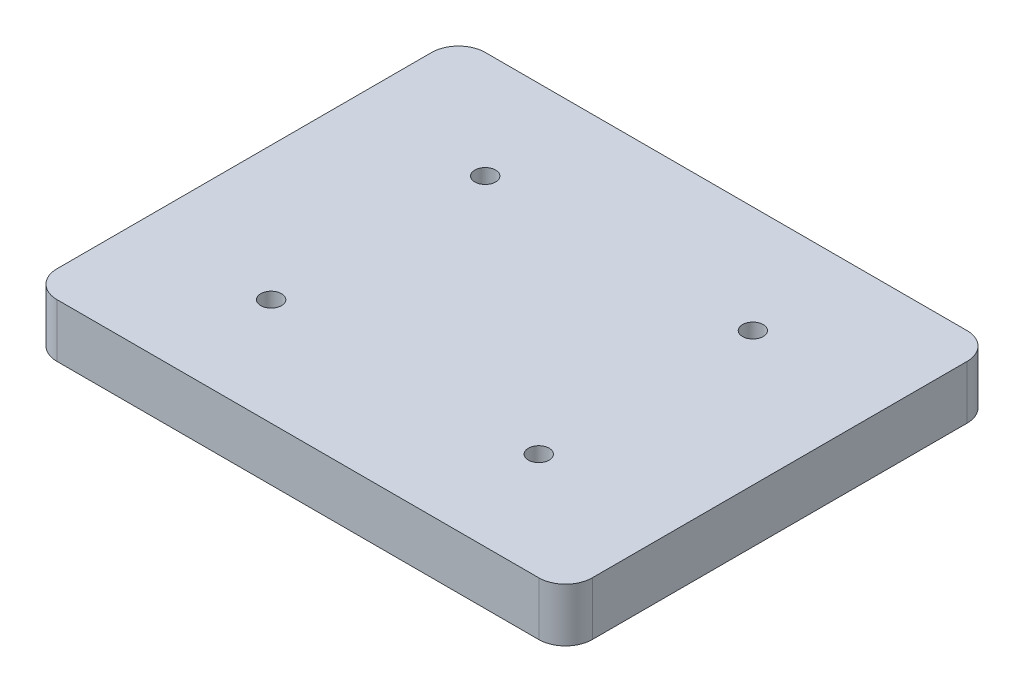
ISO-10303-21;
HEADER;
FILE_DESCRIPTION(('STEP AP214'),'2;1');
FILE_NAME('part.step','',(''),(''),'','','');
FILE_SCHEMA(('AUTOMOTIVE_DESIGN { 1 0 10303 214 1 1 1 1 }'));
ENDSEC;
DATA;
#1=APPLICATION_CONTEXT('core data for automotive mechanical design processes');
#2=APPLICATION_PROTOCOL_DEFINITION('international standard','automotive_design',2000,#1);
#3=PRODUCT_CONTEXT('',#1,'mechanical');
#4=PRODUCT('Part','Part','',(#3));
#5=PRODUCT_RELATED_PRODUCT_CATEGORY('part','',(#4));
#6=PRODUCT_DEFINITION_FORMATION('','',#4);
#7=PRODUCT_DEFINITION_CONTEXT('part definition',#1,'design');
#8=PRODUCT_DEFINITION('design','',#6,#7);
#9=PRODUCT_DEFINITION_SHAPE('','',#8);
#10=(LENGTH_UNIT() NAMED_UNIT(*) SI_UNIT(.MILLI.,.METRE.));
#11=(NAMED_UNIT(*) PLANE_ANGLE_UNIT() SI_UNIT($,.RADIAN.));
#12=(NAMED_UNIT(*) SI_UNIT($,.STERADIAN.) SOLID_ANGLE_UNIT());
#13=UNCERTAINTY_MEASURE_WITH_UNIT(LENGTH_MEASURE(1.E-05),#10,'distance_accuracy_value','');
#14=(GEOMETRIC_REPRESENTATION_CONTEXT(3) GLOBAL_UNCERTAINTY_ASSIGNED_CONTEXT((#13)) GLOBAL_UNIT_ASSIGNED_CONTEXT((#10,
#11,#12)) REPRESENTATION_CONTEXT('',''));
#15=CARTESIAN_POINT('',(0.,0.,0.));
#16=DIRECTION('',(0.,0.,1.));
#17=DIRECTION('',(1.,0.,0.));
#18=AXIS2_PLACEMENT_3D('',#15,#16,#17);
#19=CARTESIAN_POINT('',(0.,12.7,0.));
#20=DIRECTION('',(1.,0.,0.));
#21=DIRECTION('',(0.,0.,-1.));
#22=AXIS2_PLACEMENT_3D('',#19,#20,#21);
#23=PLANE('',#22);
#24=DIRECTION('',(0.,0.,1.));
#25=VECTOR('',#24,1.);
#26=CARTESIAN_POINT('',(0.,0.,0.));
#27=LINE('',#26,#25);
#28=CARTESIAN_POINT('',(0.,0.,-95.25));
#29=VERTEX_POINT('',#28);
#30=CARTESIAN_POINT('',(0.,0.,-6.35));
#31=VERTEX_POINT('',#30);
#32=EDGE_CURVE('E139',#29,#31,#27,.T.);
#33=ORIENTED_EDGE('',*,*,#32,.T.);
#34=DIRECTION('',(0.,-1.,0.));
#35=VECTOR('',#34,1.);
#36=CARTESIAN_POINT('',(0.,12.7,-6.35));
#37=LINE('',#36,#35);
#38=CARTESIAN_POINT('',(0.,12.7,-6.35));
#39=VERTEX_POINT('',#38);
#40=EDGE_CURVE('E117',#31,#39,#37,.F.);
#41=ORIENTED_EDGE('',*,*,#40,.T.);
#42=DIRECTION('',(0.,0.,1.));
#43=VECTOR('',#42,1.);
#44=CARTESIAN_POINT('',(0.,12.7,0.));
#45=LINE('',#44,#43);
#46=CARTESIAN_POINT('',(0.,12.7,-95.25));
#47=VERTEX_POINT('',#46);
#48=EDGE_CURVE('E149',#47,#39,#45,.T.);
#49=ORIENTED_EDGE('',*,*,#48,.F.);
#50=DIRECTION('',(0.,-1.,0.));
#51=VECTOR('',#50,1.);
#52=CARTESIAN_POINT('',(0.,12.7,-95.25));
#53=LINE('',#52,#51);
#54=EDGE_CURVE('E122',#47,#29,#53,.T.);
#55=ORIENTED_EDGE('',*,*,#54,.T.);
#56=EDGE_LOOP('',(#33,#41,#49,#55));
#57=FACE_BOUND('',#56,.T.);
#58=ADVANCED_FACE('F46',(#57),#23,.F.);
#59=CARTESIAN_POINT('',(0.,12.7,0.));
#60=DIRECTION('',(0.,0.,-1.));
#61=DIRECTION('',(-1.,0.,0.));
#62=AXIS2_PLACEMENT_3D('',#59,#60,#61);
#63=PLANE('',#62);
#64=DIRECTION('',(1.,0.,0.));
#65=VECTOR('',#64,1.);
#66=CARTESIAN_POINT('',(0.,12.7,0.));
#67=LINE('',#66,#65);
#68=CARTESIAN_POINT('',(6.35,12.7,0.));
#69=VERTEX_POINT('',#68);
#70=CARTESIAN_POINT('',(120.65,12.7,0.));
#71=VERTEX_POINT('',#70);
#72=EDGE_CURVE('E132',#69,#71,#67,.T.);
#73=ORIENTED_EDGE('',*,*,#72,.F.);
#74=DIRECTION('',(0.,-1.,0.));
#75=VECTOR('',#74,1.);
#76=CARTESIAN_POINT('',(6.35,12.7,0.));
#77=LINE('',#76,#75);
#78=CARTESIAN_POINT('',(6.35,0.,0.));
#79=VERTEX_POINT('',#78);
#80=EDGE_CURVE('E116',#69,#79,#77,.T.);
#81=ORIENTED_EDGE('',*,*,#80,.T.);
#82=DIRECTION('',(1.,0.,0.));
#83=VECTOR('',#82,1.);
#84=CARTESIAN_POINT('',(0.,0.,0.));
#85=LINE('',#84,#83);
#86=CARTESIAN_POINT('',(120.65,0.,0.));
#87=VERTEX_POINT('',#86);
#88=EDGE_CURVE('E129',#79,#87,#85,.T.);
#89=ORIENTED_EDGE('',*,*,#88,.T.);
#90=DIRECTION('',(0.,-1.,0.));
#91=VECTOR('',#90,1.);
#92=CARTESIAN_POINT('',(120.65,12.7,0.));
#93=LINE('',#92,#91);
#94=EDGE_CURVE('E134',#87,#71,#93,.F.);
#95=ORIENTED_EDGE('',*,*,#94,.T.);
#96=EDGE_LOOP('',(#73,#81,#89,#95));
#97=FACE_BOUND('',#96,.T.);
#98=ADVANCED_FACE('F128',(#97),#63,.F.);
#99=CARTESIAN_POINT('',(127.,12.7,0.));
#100=DIRECTION('',(-1.,0.,0.));
#101=DIRECTION('',(0.,0.,1.));
#102=AXIS2_PLACEMENT_3D('',#99,#100,#101);
#103=PLANE('',#102);
#104=DIRECTION('',(0.,0.,-1.));
#105=VECTOR('',#104,1.);
#106=CARTESIAN_POINT('',(127.,12.7,0.));
#107=LINE('',#106,#105);
#108=CARTESIAN_POINT('',(127.,12.7,-6.35));
#109=VERTEX_POINT('',#108);
#110=CARTESIAN_POINT('',(127.,12.7,-95.25));
#111=VERTEX_POINT('',#110);
#112=EDGE_CURVE('E175',#109,#111,#107,.T.);
#113=ORIENTED_EDGE('',*,*,#112,.F.);
#114=DIRECTION('',(0.,-1.,0.));
#115=VECTOR('',#114,1.);
#116=CARTESIAN_POINT('',(127.,12.7,-6.35));
#117=LINE('',#116,#115);
#118=CARTESIAN_POINT('',(127.,0.,-6.35));
#119=VERTEX_POINT('',#118);
#120=EDGE_CURVE('E168',#109,#119,#117,.T.);
#121=ORIENTED_EDGE('',*,*,#120,.T.);
#122=DIRECTION('',(0.,0.,-1.));
#123=VECTOR('',#122,1.);
#124=CARTESIAN_POINT('',(127.,0.,0.));
#125=LINE('',#124,#123);
#126=CARTESIAN_POINT('',(127.,0.,-95.25));
#127=VERTEX_POINT('',#126);
#128=EDGE_CURVE('E138',#119,#127,#125,.T.);
#129=ORIENTED_EDGE('',*,*,#128,.T.);
#130=DIRECTION('',(0.,-1.,0.));
#131=VECTOR('',#130,1.);
#132=CARTESIAN_POINT('',(127.,12.7,-95.25));
#133=LINE('',#132,#131);
#134=EDGE_CURVE('E166',#127,#111,#133,.F.);
#135=ORIENTED_EDGE('',*,*,#134,.T.);
#136=EDGE_LOOP('',(#113,#121,#129,#135));
#137=FACE_BOUND('',#136,.T.);
#138=ADVANCED_FACE('F173',(#137),#103,.F.);
#139=CARTESIAN_POINT('',(0.,12.7,-101.6));
#140=DIRECTION('',(0.,0.,1.));
#141=DIRECTION('',(1.,0.,0.));
#142=AXIS2_PLACEMENT_3D('',#139,#140,#141);
#143=PLANE('',#142);
#144=DIRECTION('',(-1.,0.,0.));
#145=VECTOR('',#144,1.);
#146=CARTESIAN_POINT('',(0.,12.7,-101.6));
#147=LINE('',#146,#145);
#148=CARTESIAN_POINT('',(120.65,12.7,-101.6));
#149=VERTEX_POINT('',#148);
#150=CARTESIAN_POINT('',(6.35,12.7,-101.6));
#151=VERTEX_POINT('',#150);
#152=EDGE_CURVE('E150',#149,#151,#147,.T.);
#153=ORIENTED_EDGE('',*,*,#152,.F.);
#154=DIRECTION('',(0.,-1.,0.));
#155=VECTOR('',#154,1.);
#156=CARTESIAN_POINT('',(120.65,12.7,-101.6));
#157=LINE('',#156,#155);
#158=CARTESIAN_POINT('',(120.65,0.,-101.6));
#159=VERTEX_POINT('',#158);
#160=EDGE_CURVE('E13',#149,#159,#157,.T.);
#161=ORIENTED_EDGE('',*,*,#160,.T.);
#162=DIRECTION('',(-1.,0.,0.));
#163=VECTOR('',#162,1.);
#164=CARTESIAN_POINT('',(0.,0.,-101.6));
#165=LINE('',#164,#163);
#166=CARTESIAN_POINT('',(6.35,0.,-101.6));
#167=VERTEX_POINT('',#166);
#168=EDGE_CURVE('E142',#159,#167,#165,.T.);
#169=ORIENTED_EDGE('',*,*,#168,.T.);
#170=DIRECTION('',(0.,-1.,0.));
#171=VECTOR('',#170,1.);
#172=CARTESIAN_POINT('',(6.35,12.7,-101.6));
#173=LINE('',#172,#171);
#174=EDGE_CURVE('E54',#167,#151,#173,.F.);
#175=ORIENTED_EDGE('',*,*,#174,.T.);
#176=EDGE_LOOP('',(#153,#161,#169,#175));
#177=FACE_BOUND('',#176,.T.);
#178=ADVANCED_FACE('F182',(#177),#143,.F.);
#179=CARTESIAN_POINT('',(0.,12.7,0.));
#180=DIRECTION('',(0.,-1.,0.));
#181=DIRECTION('',(0.,0.,-1.));
#182=AXIS2_PLACEMENT_3D('',#179,#180,#181);
#183=PLANE('',#182);
#184=CARTESIAN_POINT('',(31.75,12.7,-25.4));
#185=DIRECTION('',(0.,-1.,0.));
#186=DIRECTION('',(0.,0.,-1.));
#187=AXIS2_PLACEMENT_3D('',#184,#185,#186);
#188=CIRCLE('',#187,2.4638);
#189=CARTESIAN_POINT('',(31.75,12.7,-27.8638));
#190=VERTEX_POINT('',#189);
#191=EDGE_CURVE('E144',#190,#190,#188,.T.);
#192=ORIENTED_EDGE('',*,*,#191,.T.);
#193=EDGE_LOOP('',(#192));
#194=FACE_BOUND('',#193,.T.);
#195=CARTESIAN_POINT('',(95.25,12.7,-25.4));
#196=DIRECTION('',(0.,-1.,0.));
#197=DIRECTION('',(0.,0.,-1.));
#198=AXIS2_PLACEMENT_3D('',#195,#196,#197);
#199=CIRCLE('',#198,2.4638);
#200=CARTESIAN_POINT('',(95.25,12.7,-27.8638));
#201=VERTEX_POINT('',#200);
#202=EDGE_CURVE('E191',#201,#201,#199,.T.);
#203=ORIENTED_EDGE('',*,*,#202,.T.);
#204=EDGE_LOOP('',(#203));
#205=FACE_BOUND('',#204,.T.);
#206=CARTESIAN_POINT('',(95.25,12.7,-76.2));
#207=DIRECTION('',(0.,-1.,0.));
#208=DIRECTION('',(0.,0.,-1.));
#209=AXIS2_PLACEMENT_3D('',#206,#207,#208);
#210=CIRCLE('',#209,2.4638);
#211=CARTESIAN_POINT('',(95.25,12.7,-78.6638));
#212=VERTEX_POINT('',#211);
#213=EDGE_CURVE('E194',#212,#212,#210,.T.);
#214=ORIENTED_EDGE('',*,*,#213,.T.);
#215=EDGE_LOOP('',(#214));
#216=FACE_BOUND('',#215,.T.);
#217=CARTESIAN_POINT('',(31.75,12.7,-76.2));
#218=DIRECTION('',(0.,-1.,0.));
#219=DIRECTION('',(0.,0.,-1.));
#220=AXIS2_PLACEMENT_3D('',#217,#218,#219);
#221=CIRCLE('',#220,2.4638);
#222=CARTESIAN_POINT('',(31.75,12.7,-78.6638));
#223=VERTEX_POINT('',#222);
#224=EDGE_CURVE('E197',#223,#223,#221,.T.);
#225=ORIENTED_EDGE('',*,*,#224,.T.);
#226=EDGE_LOOP('',(#225));
#227=FACE_BOUND('',#226,.T.);
#228=ORIENTED_EDGE('',*,*,#48,.T.);
#229=CARTESIAN_POINT('',(6.35,12.7,-6.35));
#230=DIRECTION('',(0.,-1.,0.));
#231=DIRECTION('',(0.,0.,-1.));
#232=AXIS2_PLACEMENT_3D('',#229,#230,#231);
#233=CIRCLE('',#232,6.35);
#234=EDGE_CURVE('E164',#39,#69,#233,.F.);
#235=ORIENTED_EDGE('',*,*,#234,.T.);
#236=ORIENTED_EDGE('',*,*,#72,.T.);
#237=CARTESIAN_POINT('',(120.65,12.7,-6.35));
#238=DIRECTION('',(0.,-1.,0.));
#239=DIRECTION('',(0.,0.,-1.));
#240=AXIS2_PLACEMENT_3D('',#237,#238,#239);
#241=CIRCLE('',#240,6.35);
#242=EDGE_CURVE('E162',#71,#109,#241,.F.);
#243=ORIENTED_EDGE('',*,*,#242,.T.);
#244=ORIENTED_EDGE('',*,*,#112,.T.);
#245=CARTESIAN_POINT('',(120.65,12.7,-95.25));
#246=DIRECTION('',(0.,-1.,0.));
#247=DIRECTION('',(0.,0.,-1.));
#248=AXIS2_PLACEMENT_3D('',#245,#246,#247);
#249=CIRCLE('',#248,6.35);
#250=EDGE_CURVE('E67',#111,#149,#249,.F.);
#251=ORIENTED_EDGE('',*,*,#250,.T.);
#252=ORIENTED_EDGE('',*,*,#152,.T.);
#253=CARTESIAN_POINT('',(6.35,12.7,-95.25));
#254=DIRECTION('',(0.,-1.,0.));
#255=DIRECTION('',(0.,0.,-1.));
#256=AXIS2_PLACEMENT_3D('',#253,#254,#255);
#257=CIRCLE('',#256,6.35);
#258=EDGE_CURVE('E159',#151,#47,#257,.F.);
#259=ORIENTED_EDGE('',*,*,#258,.T.);
#260=EDGE_LOOP('',(#228,#235,#236,#243,#244,#251,#252,#259));
#261=FACE_BOUND('',#260,.T.);
#262=ADVANCED_FACE('F223',(#194,#205,#216,#227,#261),#183,.F.);
#263=CARTESIAN_POINT('',(0.,0.,0.));
#264=DIRECTION('',(0.,-1.,0.));
#265=DIRECTION('',(0.,0.,-1.));
#266=AXIS2_PLACEMENT_3D('',#263,#264,#265);
#267=PLANE('',#266);
#268=CARTESIAN_POINT('',(31.75,0.,-25.4));
#269=DIRECTION('',(0.,1.,0.));
#270=DIRECTION('',(0.,0.,1.));
#271=AXIS2_PLACEMENT_3D('',#268,#269,#270);
#272=CIRCLE('',#271,2.4638);
#273=CARTESIAN_POINT('',(31.75,0.,-22.9362));
#274=VERTEX_POINT('',#273);
#275=EDGE_CURVE('E204',#274,#274,#272,.T.);
#276=ORIENTED_EDGE('',*,*,#275,.T.);
#277=EDGE_LOOP('',(#276));
#278=FACE_BOUND('',#277,.T.);
#279=CARTESIAN_POINT('',(95.25,0.,-25.4));
#280=DIRECTION('',(0.,1.,0.));
#281=DIRECTION('',(0.,0.,1.));
#282=AXIS2_PLACEMENT_3D('',#279,#280,#281);
#283=CIRCLE('',#282,2.4638);
#284=CARTESIAN_POINT('',(95.25,0.,-22.9362));
#285=VERTEX_POINT('',#284);
#286=EDGE_CURVE('E207',#285,#285,#283,.T.);
#287=ORIENTED_EDGE('',*,*,#286,.T.);
#288=EDGE_LOOP('',(#287));
#289=FACE_BOUND('',#288,.T.);
#290=CARTESIAN_POINT('',(95.25,0.,-76.2));
#291=DIRECTION('',(0.,1.,0.));
#292=DIRECTION('',(0.,0.,1.));
#293=AXIS2_PLACEMENT_3D('',#290,#291,#292);
#294=CIRCLE('',#293,2.4638);
#295=CARTESIAN_POINT('',(95.25,0.,-73.7362));
#296=VERTEX_POINT('',#295);
#297=EDGE_CURVE('E203',#296,#296,#294,.T.);
#298=ORIENTED_EDGE('',*,*,#297,.T.);
#299=EDGE_LOOP('',(#298));
#300=FACE_BOUND('',#299,.T.);
#301=CARTESIAN_POINT('',(31.75,0.,-76.2));
#302=DIRECTION('',(0.,1.,0.));
#303=DIRECTION('',(0.,0.,1.));
#304=AXIS2_PLACEMENT_3D('',#301,#302,#303);
#305=CIRCLE('',#304,2.4638);
#306=CARTESIAN_POINT('',(31.75,0.,-73.7362));
#307=VERTEX_POINT('',#306);
#308=EDGE_CURVE('E200',#307,#307,#305,.T.);
#309=ORIENTED_EDGE('',*,*,#308,.T.);
#310=EDGE_LOOP('',(#309));
#311=FACE_BOUND('',#310,.T.);
#312=ORIENTED_EDGE('',*,*,#88,.F.);
#313=CARTESIAN_POINT('',(6.35,0.,-6.35));
#314=DIRECTION('',(0.,-1.,0.));
#315=DIRECTION('',(0.,0.,-1.));
#316=AXIS2_PLACEMENT_3D('',#313,#314,#315);
#317=CIRCLE('',#316,6.35);
#318=EDGE_CURVE('E112',#79,#31,#317,.T.);
#319=ORIENTED_EDGE('',*,*,#318,.T.);
#320=ORIENTED_EDGE('',*,*,#32,.F.);
#321=CARTESIAN_POINT('',(6.35,0.,-95.25));
#322=DIRECTION('',(0.,-1.,0.));
#323=DIRECTION('',(0.,0.,-1.));
#324=AXIS2_PLACEMENT_3D('',#321,#322,#323);
#325=CIRCLE('',#324,6.35);
#326=EDGE_CURVE('E133',#29,#167,#325,.T.);
#327=ORIENTED_EDGE('',*,*,#326,.T.);
#328=ORIENTED_EDGE('',*,*,#168,.F.);
#329=CARTESIAN_POINT('',(120.65,0.,-95.25));
#330=DIRECTION('',(0.,-1.,0.));
#331=DIRECTION('',(0.,0.,-1.));
#332=AXIS2_PLACEMENT_3D('',#329,#330,#331);
#333=CIRCLE('',#332,6.35);
#334=EDGE_CURVE('E153',#159,#127,#333,.T.);
#335=ORIENTED_EDGE('',*,*,#334,.T.);
#336=ORIENTED_EDGE('',*,*,#128,.F.);
#337=CARTESIAN_POINT('',(120.65,0.,-6.35));
#338=DIRECTION('',(0.,-1.,0.));
#339=DIRECTION('',(0.,0.,-1.));
#340=AXIS2_PLACEMENT_3D('',#337,#338,#339);
#341=CIRCLE('',#340,6.35);
#342=EDGE_CURVE('E123',#119,#87,#341,.T.);
#343=ORIENTED_EDGE('',*,*,#342,.T.);
#344=EDGE_LOOP('',(#312,#319,#320,#327,#328,#335,#336,#343));
#345=FACE_BOUND('',#344,.T.);
#346=ADVANCED_FACE('F136',(#278,#289,#300,#311,#345),#267,.T.);
#347=CARTESIAN_POINT('',(31.75,0.,-76.2));
#348=DIRECTION('',(0.,1.,0.));
#349=DIRECTION('',(0.,0.,1.));
#350=AXIS2_PLACEMENT_3D('',#347,#348,#349);
#351=CYLINDRICAL_SURFACE('',#350,2.4638);
#352=ORIENTED_EDGE('',*,*,#308,.F.);
#353=EDGE_LOOP('',(#352));
#354=FACE_BOUND('',#353,.T.);
#355=ORIENTED_EDGE('',*,*,#224,.F.);
#356=EDGE_LOOP('',(#355));
#357=FACE_BOUND('',#356,.T.);
#358=ADVANCED_FACE('F219',(#354,#357),#351,.F.);
#359=CARTESIAN_POINT('',(95.25,0.,-76.2));
#360=DIRECTION('',(0.,1.,0.));
#361=DIRECTION('',(0.,0.,1.));
#362=AXIS2_PLACEMENT_3D('',#359,#360,#361);
#363=CYLINDRICAL_SURFACE('',#362,2.4638);
#364=ORIENTED_EDGE('',*,*,#297,.F.);
#365=EDGE_LOOP('',(#364));
#366=FACE_BOUND('',#365,.T.);
#367=ORIENTED_EDGE('',*,*,#213,.F.);
#368=EDGE_LOOP('',(#367));
#369=FACE_BOUND('',#368,.T.);
#370=ADVANCED_FACE('F215',(#366,#369),#363,.F.);
#371=CARTESIAN_POINT('',(95.25,0.,-25.4));
#372=DIRECTION('',(0.,1.,0.));
#373=DIRECTION('',(0.,0.,1.));
#374=AXIS2_PLACEMENT_3D('',#371,#372,#373);
#375=CYLINDRICAL_SURFACE('',#374,2.4638);
#376=ORIENTED_EDGE('',*,*,#286,.F.);
#377=EDGE_LOOP('',(#376));
#378=FACE_BOUND('',#377,.T.);
#379=ORIENTED_EDGE('',*,*,#202,.F.);
#380=EDGE_LOOP('',(#379));
#381=FACE_BOUND('',#380,.T.);
#382=ADVANCED_FACE('F218',(#378,#381),#375,.F.);
#383=CARTESIAN_POINT('',(31.75,0.,-25.4));
#384=DIRECTION('',(0.,1.,0.));
#385=DIRECTION('',(0.,0.,1.));
#386=AXIS2_PLACEMENT_3D('',#383,#384,#385);
#387=CYLINDRICAL_SURFACE('',#386,2.4638);
#388=ORIENTED_EDGE('',*,*,#275,.F.);
#389=EDGE_LOOP('',(#388));
#390=FACE_BOUND('',#389,.T.);
#391=ORIENTED_EDGE('',*,*,#191,.F.);
#392=EDGE_LOOP('',(#391));
#393=FACE_BOUND('',#392,.T.);
#394=ADVANCED_FACE('F248',(#390,#393),#387,.F.);
#395=CARTESIAN_POINT('',(6.35,12.7,-6.35));
#396=DIRECTION('',(0.,-1.,0.));
#397=DIRECTION('',(0.,0.,-1.));
#398=AXIS2_PLACEMENT_3D('',#395,#396,#397);
#399=CYLINDRICAL_SURFACE('',#398,6.35);
#400=ORIENTED_EDGE('',*,*,#234,.F.);
#401=ORIENTED_EDGE('',*,*,#40,.F.);
#402=ORIENTED_EDGE('',*,*,#318,.F.);
#403=ORIENTED_EDGE('',*,*,#80,.F.);
#404=EDGE_LOOP('',(#400,#401,#402,#403));
#405=FACE_BOUND('',#404,.T.);
#406=ADVANCED_FACE('F115',(#405),#399,.T.);
#407=CARTESIAN_POINT('',(120.65,12.7,-6.35));
#408=DIRECTION('',(0.,-1.,0.));
#409=DIRECTION('',(0.,0.,-1.));
#410=AXIS2_PLACEMENT_3D('',#407,#408,#409);
#411=CYLINDRICAL_SURFACE('',#410,6.35);
#412=ORIENTED_EDGE('',*,*,#242,.F.);
#413=ORIENTED_EDGE('',*,*,#94,.F.);
#414=ORIENTED_EDGE('',*,*,#342,.F.);
#415=ORIENTED_EDGE('',*,*,#120,.F.);
#416=EDGE_LOOP('',(#412,#413,#414,#415));
#417=FACE_BOUND('',#416,.T.);
#418=ADVANCED_FACE('F237',(#417),#411,.T.);
#419=CARTESIAN_POINT('',(120.65,12.7,-95.25));
#420=DIRECTION('',(0.,-1.,0.));
#421=DIRECTION('',(0.,0.,-1.));
#422=AXIS2_PLACEMENT_3D('',#419,#420,#421);
#423=CYLINDRICAL_SURFACE('',#422,6.35);
#424=ORIENTED_EDGE('',*,*,#250,.F.);
#425=ORIENTED_EDGE('',*,*,#134,.F.);
#426=ORIENTED_EDGE('',*,*,#334,.F.);
#427=ORIENTED_EDGE('',*,*,#160,.F.);
#428=EDGE_LOOP('',(#424,#425,#426,#427));
#429=FACE_BOUND('',#428,.T.);
#430=ADVANCED_FACE('F181',(#429),#423,.T.);
#431=CARTESIAN_POINT('',(6.35,12.7,-95.25));
#432=DIRECTION('',(0.,-1.,0.));
#433=DIRECTION('',(0.,0.,-1.));
#434=AXIS2_PLACEMENT_3D('',#431,#432,#433);
#435=CYLINDRICAL_SURFACE('',#434,6.35);
#436=ORIENTED_EDGE('',*,*,#258,.F.);
#437=ORIENTED_EDGE('',*,*,#174,.F.);
#438=ORIENTED_EDGE('',*,*,#326,.F.);
#439=ORIENTED_EDGE('',*,*,#54,.F.);
#440=EDGE_LOOP('',(#436,#437,#438,#439));
#441=FACE_BOUND('',#440,.T.);
#442=ADVANCED_FACE('F48',(#441),#435,.T.);
#443=CLOSED_SHELL('',(#58,#98,#138,#178,#262,#346,#358,#370,#382,#394,#406,#418,#430,#442));
#444=MANIFOLD_SOLID_BREP('B2',#443);
#445=ADVANCED_BREP_SHAPE_REPRESENTATION('',(#18,#444),#14);
#446=SHAPE_DEFINITION_REPRESENTATION(#9,#445);
ENDSEC;
END-ISO-10303-21;
